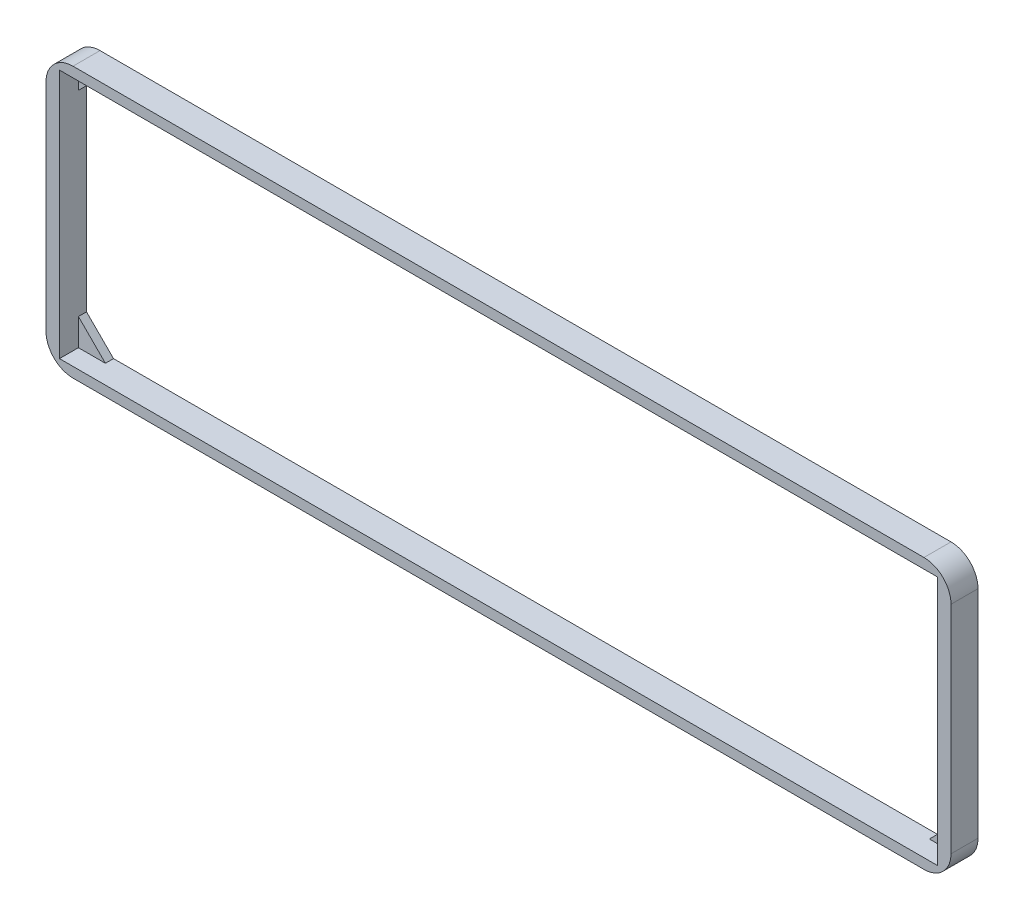
ISO-10303-21;
HEADER;
FILE_DESCRIPTION(('STEP AP214'),'2;1');
FILE_NAME('part.step','',(''),(''),'','','');
FILE_SCHEMA(('AUTOMOTIVE_DESIGN { 1 0 10303 214 1 1 1 1 }'));
ENDSEC;
DATA;
#1=APPLICATION_CONTEXT('core data for automotive mechanical design processes');
#2=APPLICATION_PROTOCOL_DEFINITION('international standard','automotive_design',2000,#1);
#3=PRODUCT_CONTEXT('',#1,'mechanical');
#4=PRODUCT('Part','Part','',(#3));
#5=PRODUCT_RELATED_PRODUCT_CATEGORY('part','',(#4));
#6=PRODUCT_DEFINITION_FORMATION('','',#4);
#7=PRODUCT_DEFINITION_CONTEXT('part definition',#1,'design');
#8=PRODUCT_DEFINITION('design','',#6,#7);
#9=PRODUCT_DEFINITION_SHAPE('','',#8);
#10=(LENGTH_UNIT() NAMED_UNIT(*) SI_UNIT(.MILLI.,.METRE.));
#11=(NAMED_UNIT(*) PLANE_ANGLE_UNIT() SI_UNIT($,.RADIAN.));
#12=(NAMED_UNIT(*) SI_UNIT($,.STERADIAN.) SOLID_ANGLE_UNIT());
#13=UNCERTAINTY_MEASURE_WITH_UNIT(LENGTH_MEASURE(1.E-05),#10,'distance_accuracy_value','');
#14=(GEOMETRIC_REPRESENTATION_CONTEXT(3) GLOBAL_UNCERTAINTY_ASSIGNED_CONTEXT((#13)) GLOBAL_UNIT_ASSIGNED_CONTEXT((#10,
#11,#12)) REPRESENTATION_CONTEXT('',''));
#15=CARTESIAN_POINT('',(0.,0.,0.));
#16=DIRECTION('',(0.,0.,1.));
#17=DIRECTION('',(1.,0.,0.));
#18=AXIS2_PLACEMENT_3D('',#15,#16,#17);
#19=CARTESIAN_POINT('',(167.5,-50.,-10.));
#20=DIRECTION('',(1.,0.,0.));
#21=DIRECTION('',(0.,0.,-1.));
#22=AXIS2_PLACEMENT_3D('',#19,#20,#21);
#23=PLANE('',#22);
#24=DIRECTION('',(0.,1.,0.));
#25=VECTOR('',#24,1.);
#26=CARTESIAN_POINT('',(167.5,-50.,0.));
#27=LINE('',#26,#25);
#28=CARTESIAN_POINT('',(167.5,-40.,0.));
#29=VERTEX_POINT('',#28);
#30=CARTESIAN_POINT('',(167.5,40.,0.));
#31=VERTEX_POINT('',#30);
#32=EDGE_CURVE('E213',#29,#31,#27,.T.);
#33=ORIENTED_EDGE('',*,*,#32,.F.);
#34=DIRECTION('',(0.,0.,1.));
#35=VECTOR('',#34,1.);
#36=CARTESIAN_POINT('',(167.5,-40.,-10.));
#37=LINE('',#36,#35);
#38=CARTESIAN_POINT('',(167.5,-40.,-10.));
#39=VERTEX_POINT('',#38);
#40=EDGE_CURVE('E11',#29,#39,#37,.F.);
#41=ORIENTED_EDGE('',*,*,#40,.T.);
#42=DIRECTION('',(0.,1.,0.));
#43=VECTOR('',#42,1.);
#44=CARTESIAN_POINT('',(167.5,-50.,-10.));
#45=LINE('',#44,#43);
#46=CARTESIAN_POINT('',(167.5,40.,-10.));
#47=VERTEX_POINT('',#46);
#48=EDGE_CURVE('E222',#39,#47,#45,.T.);
#49=ORIENTED_EDGE('',*,*,#48,.T.);
#50=DIRECTION('',(0.,0.,1.));
#51=VECTOR('',#50,1.);
#52=CARTESIAN_POINT('',(167.5,40.,-10.));
#53=LINE('',#52,#51);
#54=EDGE_CURVE('E50',#47,#31,#53,.T.);
#55=ORIENTED_EDGE('',*,*,#54,.T.);
#56=EDGE_LOOP('',(#33,#41,#49,#55));
#57=FACE_BOUND('',#56,.T.);
#58=ADVANCED_FACE('F41',(#57),#23,.T.);
#59=CARTESIAN_POINT('',(-167.5,-50.,-10.));
#60=DIRECTION('',(0.,-1.,0.));
#61=DIRECTION('',(0.,0.,-1.));
#62=AXIS2_PLACEMENT_3D('',#59,#60,#61);
#63=PLANE('',#62);
#64=DIRECTION('',(1.,0.,0.));
#65=VECTOR('',#64,1.);
#66=CARTESIAN_POINT('',(-167.5,-50.,0.));
#67=LINE('',#66,#65);
#68=CARTESIAN_POINT('',(-157.5,-50.,0.));
#69=VERTEX_POINT('',#68);
#70=CARTESIAN_POINT('',(157.5,-50.,0.));
#71=VERTEX_POINT('',#70);
#72=EDGE_CURVE('E227',#69,#71,#67,.T.);
#73=ORIENTED_EDGE('',*,*,#72,.F.);
#74=DIRECTION('',(0.,0.,1.));
#75=VECTOR('',#74,1.);
#76=CARTESIAN_POINT('',(-157.5,-50.,-10.));
#77=LINE('',#76,#75);
#78=CARTESIAN_POINT('',(-157.5,-50.,-10.));
#79=VERTEX_POINT('',#78);
#80=EDGE_CURVE('E293',#69,#79,#77,.F.);
#81=ORIENTED_EDGE('',*,*,#80,.T.);
#82=DIRECTION('',(1.,0.,0.));
#83=VECTOR('',#82,1.);
#84=CARTESIAN_POINT('',(-167.5,-50.,-10.));
#85=LINE('',#84,#83);
#86=CARTESIAN_POINT('',(157.5,-50.,-10.));
#87=VERTEX_POINT('',#86);
#88=EDGE_CURVE('E235',#79,#87,#85,.T.);
#89=ORIENTED_EDGE('',*,*,#88,.T.);
#90=DIRECTION('',(0.,0.,1.));
#91=VECTOR('',#90,1.);
#92=CARTESIAN_POINT('',(157.5,-50.,-10.));
#93=LINE('',#92,#91);
#94=EDGE_CURVE('E289',#87,#71,#93,.T.);
#95=ORIENTED_EDGE('',*,*,#94,.T.);
#96=EDGE_LOOP('',(#73,#81,#89,#95));
#97=FACE_BOUND('',#96,.T.);
#98=ADVANCED_FACE('F311',(#97),#63,.T.);
#99=CARTESIAN_POINT('',(-167.5,-50.,-10.));
#100=DIRECTION('',(-1.,0.,0.));
#101=DIRECTION('',(0.,0.,1.));
#102=AXIS2_PLACEMENT_3D('',#99,#100,#101);
#103=PLANE('',#102);
#104=DIRECTION('',(0.,-1.,0.));
#105=VECTOR('',#104,1.);
#106=CARTESIAN_POINT('',(-167.5,-50.,0.));
#107=LINE('',#106,#105);
#108=CARTESIAN_POINT('',(-167.5,40.,0.));
#109=VERTEX_POINT('',#108);
#110=CARTESIAN_POINT('',(-167.5,-40.,0.));
#111=VERTEX_POINT('',#110);
#112=EDGE_CURVE('E246',#109,#111,#107,.T.);
#113=ORIENTED_EDGE('',*,*,#112,.F.);
#114=DIRECTION('',(0.,0.,1.));
#115=VECTOR('',#114,1.);
#116=CARTESIAN_POINT('',(-167.5,40.,-10.));
#117=LINE('',#116,#115);
#118=CARTESIAN_POINT('',(-167.5,40.,-10.));
#119=VERTEX_POINT('',#118);
#120=EDGE_CURVE('E275',#109,#119,#117,.F.);
#121=ORIENTED_EDGE('',*,*,#120,.T.);
#122=DIRECTION('',(0.,-1.,0.));
#123=VECTOR('',#122,1.);
#124=CARTESIAN_POINT('',(-167.5,-50.,-10.));
#125=LINE('',#124,#123);
#126=CARTESIAN_POINT('',(-167.5,-40.,-10.));
#127=VERTEX_POINT('',#126);
#128=EDGE_CURVE('E231',#119,#127,#125,.T.);
#129=ORIENTED_EDGE('',*,*,#128,.T.);
#130=DIRECTION('',(0.,0.,1.));
#131=VECTOR('',#130,1.);
#132=CARTESIAN_POINT('',(-167.5,-40.,-10.));
#133=LINE('',#132,#131);
#134=EDGE_CURVE('E271',#127,#111,#133,.T.);
#135=ORIENTED_EDGE('',*,*,#134,.T.);
#136=EDGE_LOOP('',(#113,#121,#129,#135));
#137=FACE_BOUND('',#136,.T.);
#138=ADVANCED_FACE('F321',(#137),#103,.T.);
#139=CARTESIAN_POINT('',(-167.5,50.,-10.));
#140=DIRECTION('',(0.,1.,0.));
#141=DIRECTION('',(0.,0.,1.));
#142=AXIS2_PLACEMENT_3D('',#139,#140,#141);
#143=PLANE('',#142);
#144=DIRECTION('',(-1.,0.,0.));
#145=VECTOR('',#144,1.);
#146=CARTESIAN_POINT('',(-167.5,50.,-10.));
#147=LINE('',#146,#145);
#148=CARTESIAN_POINT('',(157.5,50.,-10.));
#149=VERTEX_POINT('',#148);
#150=CARTESIAN_POINT('',(-157.5,50.,-10.));
#151=VERTEX_POINT('',#150);
#152=EDGE_CURVE('E226',#149,#151,#147,.T.);
#153=ORIENTED_EDGE('',*,*,#152,.T.);
#154=DIRECTION('',(0.,0.,1.));
#155=VECTOR('',#154,1.);
#156=CARTESIAN_POINT('',(-157.5,50.,-10.));
#157=LINE('',#156,#155);
#158=CARTESIAN_POINT('',(-157.5,50.,0.));
#159=VERTEX_POINT('',#158);
#160=EDGE_CURVE('E255',#151,#159,#157,.T.);
#161=ORIENTED_EDGE('',*,*,#160,.T.);
#162=DIRECTION('',(-1.,0.,0.));
#163=VECTOR('',#162,1.);
#164=CARTESIAN_POINT('',(-167.5,50.,0.));
#165=LINE('',#164,#163);
#166=CARTESIAN_POINT('',(157.5,50.,0.));
#167=VERTEX_POINT('',#166);
#168=EDGE_CURVE('E242',#167,#159,#165,.T.);
#169=ORIENTED_EDGE('',*,*,#168,.F.);
#170=DIRECTION('',(0.,0.,1.));
#171=VECTOR('',#170,1.);
#172=CARTESIAN_POINT('',(157.5,50.,-10.));
#173=LINE('',#172,#171);
#174=EDGE_CURVE('E238',#167,#149,#173,.F.);
#175=ORIENTED_EDGE('',*,*,#174,.T.);
#176=EDGE_LOOP('',(#153,#161,#169,#175));
#177=FACE_BOUND('',#176,.T.);
#178=ADVANCED_FACE('F328',(#177),#143,.T.);
#179=CARTESIAN_POINT('',(0.,0.,-10.));
#180=DIRECTION('',(0.,0.,-1.));
#181=DIRECTION('',(-1.,0.,0.));
#182=AXIS2_PLACEMENT_3D('',#179,#180,#181);
#183=PLANE('',#182);
#184=DIRECTION('',(0.707106781186548,-0.707106781186547,0.));
#185=VECTOR('',#184,1.);
#186=CARTESIAN_POINT('',(-162.5,-36.25,-10.));
#187=LINE('',#186,#185);
#188=CARTESIAN_POINT('',(-162.5,-36.25,-10.));
#189=VERTEX_POINT('',#188);
#190=CARTESIAN_POINT('',(-152.5,-46.25,-10.));
#191=VERTEX_POINT('',#190);
#192=EDGE_CURVE('E201',#189,#191,#187,.T.);
#193=ORIENTED_EDGE('',*,*,#192,.T.);
#194=DIRECTION('',(1.,0.,0.));
#195=VECTOR('',#194,1.);
#196=CARTESIAN_POINT('',(-162.5,-46.25,-10.));
#197=LINE('',#196,#195);
#198=CARTESIAN_POINT('',(152.5,-46.25,-10.));
#199=VERTEX_POINT('',#198);
#200=EDGE_CURVE('E221',#191,#199,#197,.T.);
#201=ORIENTED_EDGE('',*,*,#200,.T.);
#202=DIRECTION('',(0.707106781186547,0.707106781186547,0.));
#203=VECTOR('',#202,1.);
#204=CARTESIAN_POINT('',(162.5,-36.25,-10.));
#205=LINE('',#204,#203);
#206=CARTESIAN_POINT('',(162.5,-36.25,-10.));
#207=VERTEX_POINT('',#206);
#208=EDGE_CURVE('E572',#199,#207,#205,.T.);
#209=ORIENTED_EDGE('',*,*,#208,.T.);
#210=DIRECTION('',(0.,1.,0.));
#211=VECTOR('',#210,1.);
#212=CARTESIAN_POINT('',(162.5,-46.25,-10.));
#213=LINE('',#212,#211);
#214=CARTESIAN_POINT('',(162.5,36.2499999999998,-10.));
#215=VERTEX_POINT('',#214);
#216=EDGE_CURVE('E553',#207,#215,#213,.T.);
#217=ORIENTED_EDGE('',*,*,#216,.T.);
#218=DIRECTION('',(-0.707106781186542,0.707106781186553,0.));
#219=VECTOR('',#218,1.);
#220=CARTESIAN_POINT('',(152.5,46.25,-10.));
#221=LINE('',#220,#219);
#222=CARTESIAN_POINT('',(152.5,46.25,-10.));
#223=VERTEX_POINT('',#222);
#224=EDGE_CURVE('E57',#215,#223,#221,.T.);
#225=ORIENTED_EDGE('',*,*,#224,.T.);
#226=DIRECTION('',(-1.,0.,0.));
#227=VECTOR('',#226,1.);
#228=CARTESIAN_POINT('',(-162.5,46.25,-10.));
#229=LINE('',#228,#227);
#230=CARTESIAN_POINT('',(-152.5,46.25,-10.));
#231=VERTEX_POINT('',#230);
#232=EDGE_CURVE('E556',#223,#231,#229,.T.);
#233=ORIENTED_EDGE('',*,*,#232,.T.);
#234=DIRECTION('',(-0.707106781186548,-0.707106781186547,0.));
#235=VECTOR('',#234,1.);
#236=CARTESIAN_POINT('',(-152.5,46.25,-10.));
#237=LINE('',#236,#235);
#238=CARTESIAN_POINT('',(-162.5,36.25,-10.));
#239=VERTEX_POINT('',#238);
#240=EDGE_CURVE('E621',#231,#239,#237,.T.);
#241=ORIENTED_EDGE('',*,*,#240,.T.);
#242=DIRECTION('',(0.,-1.,0.));
#243=VECTOR('',#242,1.);
#244=CARTESIAN_POINT('',(-162.5,-46.25,-10.));
#245=LINE('',#244,#243);
#246=EDGE_CURVE('E561',#239,#189,#245,.T.);
#247=ORIENTED_EDGE('',*,*,#246,.T.);
#248=EDGE_LOOP('',(#193,#201,#209,#217,#225,#233,#241,#247));
#249=FACE_BOUND('',#248,.T.);
#250=ORIENTED_EDGE('',*,*,#128,.F.);
#251=CARTESIAN_POINT('',(-157.5,40.,-10.));
#252=DIRECTION('',(0.,0.,-1.));
#253=DIRECTION('',(-1.,0.,0.));
#254=AXIS2_PLACEMENT_3D('',#251,#252,#253);
#255=CIRCLE('',#254,10.);
#256=EDGE_CURVE('E286',#119,#151,#255,.T.);
#257=ORIENTED_EDGE('',*,*,#256,.T.);
#258=ORIENTED_EDGE('',*,*,#152,.F.);
#259=CARTESIAN_POINT('',(157.5,40.,-10.));
#260=DIRECTION('',(0.,0.,-1.));
#261=DIRECTION('',(-1.,0.,0.));
#262=AXIS2_PLACEMENT_3D('',#259,#260,#261);
#263=CIRCLE('',#262,10.);
#264=EDGE_CURVE('E278',#149,#47,#263,.T.);
#265=ORIENTED_EDGE('',*,*,#264,.T.);
#266=ORIENTED_EDGE('',*,*,#48,.F.);
#267=CARTESIAN_POINT('',(157.5,-40.,-10.));
#268=DIRECTION('',(0.,0.,-1.));
#269=DIRECTION('',(-1.,0.,0.));
#270=AXIS2_PLACEMENT_3D('',#267,#268,#269);
#271=CIRCLE('',#270,10.);
#272=EDGE_CURVE('E65',#39,#87,#271,.T.);
#273=ORIENTED_EDGE('',*,*,#272,.T.);
#274=ORIENTED_EDGE('',*,*,#88,.F.);
#275=CARTESIAN_POINT('',(-157.5,-40.,-10.));
#276=DIRECTION('',(0.,0.,-1.));
#277=DIRECTION('',(-1.,0.,0.));
#278=AXIS2_PLACEMENT_3D('',#275,#276,#277);
#279=CIRCLE('',#278,10.);
#280=EDGE_CURVE('E283',#79,#127,#279,.T.);
#281=ORIENTED_EDGE('',*,*,#280,.T.);
#282=EDGE_LOOP('',(#250,#257,#258,#265,#266,#273,#274,#281));
#283=FACE_BOUND('',#282,.T.);
#284=ADVANCED_FACE('F315',(#249,#283),#183,.T.);
#285=CARTESIAN_POINT('',(0.,0.,0.));
#286=DIRECTION('',(0.,0.,-1.));
#287=DIRECTION('',(-1.,0.,0.));
#288=AXIS2_PLACEMENT_3D('',#285,#286,#287);
#289=PLANE('',#288);
#290=DIRECTION('',(-1.,0.,0.));
#291=VECTOR('',#290,1.);
#292=CARTESIAN_POINT('',(-162.5,46.25,0.));
#293=LINE('',#292,#291);
#294=CARTESIAN_POINT('',(162.5,46.25,0.));
#295=VERTEX_POINT('',#294);
#296=CARTESIAN_POINT('',(-162.5,46.25,0.));
#297=VERTEX_POINT('',#296);
#298=EDGE_CURVE('E539',#295,#297,#293,.T.);
#299=ORIENTED_EDGE('',*,*,#298,.F.);
#300=DIRECTION('',(0.,1.,0.));
#301=VECTOR('',#300,1.);
#302=CARTESIAN_POINT('',(162.5,-46.25,0.));
#303=LINE('',#302,#301);
#304=CARTESIAN_POINT('',(162.5,-46.25,0.));
#305=VERTEX_POINT('',#304);
#306=EDGE_CURVE('E541',#305,#295,#303,.T.);
#307=ORIENTED_EDGE('',*,*,#306,.F.);
#308=DIRECTION('',(1.,0.,0.));
#309=VECTOR('',#308,1.);
#310=CARTESIAN_POINT('',(-162.5,-46.25,0.));
#311=LINE('',#310,#309);
#312=CARTESIAN_POINT('',(-162.5,-46.25,0.));
#313=VERTEX_POINT('',#312);
#314=EDGE_CURVE('E547',#313,#305,#311,.T.);
#315=ORIENTED_EDGE('',*,*,#314,.F.);
#316=DIRECTION('',(0.,-1.,0.));
#317=VECTOR('',#316,1.);
#318=CARTESIAN_POINT('',(-162.5,-46.25,0.));
#319=LINE('',#318,#317);
#320=EDGE_CURVE('E205',#297,#313,#319,.T.);
#321=ORIENTED_EDGE('',*,*,#320,.F.);
#322=EDGE_LOOP('',(#299,#307,#315,#321));
#323=FACE_BOUND('',#322,.T.);
#324=ORIENTED_EDGE('',*,*,#168,.T.);
#325=CARTESIAN_POINT('',(-157.5,40.,0.));
#326=DIRECTION('',(0.,0.,-1.));
#327=DIRECTION('',(-1.,0.,0.));
#328=AXIS2_PLACEMENT_3D('',#325,#326,#327);
#329=CIRCLE('',#328,10.);
#330=EDGE_CURVE('E268',#159,#109,#329,.F.);
#331=ORIENTED_EDGE('',*,*,#330,.T.);
#332=ORIENTED_EDGE('',*,*,#112,.T.);
#333=CARTESIAN_POINT('',(-157.5,-40.,0.));
#334=DIRECTION('',(0.,0.,-1.));
#335=DIRECTION('',(-1.,0.,0.));
#336=AXIS2_PLACEMENT_3D('',#333,#334,#335);
#337=CIRCLE('',#336,10.);
#338=EDGE_CURVE('E265',#111,#69,#337,.F.);
#339=ORIENTED_EDGE('',*,*,#338,.T.);
#340=ORIENTED_EDGE('',*,*,#72,.T.);
#341=CARTESIAN_POINT('',(157.5,-40.,0.));
#342=DIRECTION('',(0.,0.,-1.));
#343=DIRECTION('',(-1.,0.,0.));
#344=AXIS2_PLACEMENT_3D('',#341,#342,#343);
#345=CIRCLE('',#344,10.);
#346=EDGE_CURVE('E262',#71,#29,#345,.F.);
#347=ORIENTED_EDGE('',*,*,#346,.T.);
#348=ORIENTED_EDGE('',*,*,#32,.T.);
#349=CARTESIAN_POINT('',(157.5,40.,0.));
#350=DIRECTION('',(0.,0.,-1.));
#351=DIRECTION('',(-1.,0.,0.));
#352=AXIS2_PLACEMENT_3D('',#349,#350,#351);
#353=CIRCLE('',#352,10.);
#354=EDGE_CURVE('E259',#31,#167,#353,.F.);
#355=ORIENTED_EDGE('',*,*,#354,.T.);
#356=EDGE_LOOP('',(#324,#331,#332,#339,#340,#347,#348,#355));
#357=FACE_BOUND('',#356,.T.);
#358=ADVANCED_FACE('F304',(#323,#357),#289,.F.);
#359=CARTESIAN_POINT('',(162.5,-46.25,-10.));
#360=DIRECTION('',(1.,0.,0.));
#361=DIRECTION('',(0.,0.,-1.));
#362=AXIS2_PLACEMENT_3D('',#359,#360,#361);
#363=PLANE('',#362);
#364=DIRECTION('',(0.,-1.,0.));
#365=VECTOR('',#364,1.);
#366=CARTESIAN_POINT('',(162.5,36.2499999999998,-7.));
#367=LINE('',#366,#365);
#368=CARTESIAN_POINT('',(162.5,46.25,-7.));
#369=VERTEX_POINT('',#368);
#370=CARTESIAN_POINT('',(162.5,36.2499999999998,-7.));
#371=VERTEX_POINT('',#370);
#372=EDGE_CURVE('E603',#369,#371,#367,.T.);
#373=ORIENTED_EDGE('',*,*,#372,.T.);
#374=DIRECTION('',(0.,0.,-1.));
#375=VECTOR('',#374,1.);
#376=CARTESIAN_POINT('',(162.5,36.2499999999998,-7.));
#377=LINE('',#376,#375);
#378=EDGE_CURVE('E594',#371,#215,#377,.T.);
#379=ORIENTED_EDGE('',*,*,#378,.T.);
#380=ORIENTED_EDGE('',*,*,#216,.F.);
#381=DIRECTION('',(0.,0.,-1.));
#382=VECTOR('',#381,1.);
#383=CARTESIAN_POINT('',(162.5,-36.25,-7.));
#384=LINE('',#383,#382);
#385=CARTESIAN_POINT('',(162.5,-36.25,-7.));
#386=VERTEX_POINT('',#385);
#387=EDGE_CURVE('E549',#386,#207,#384,.T.);
#388=ORIENTED_EDGE('',*,*,#387,.F.);
#389=DIRECTION('',(0.,-1.,0.));
#390=VECTOR('',#389,1.);
#391=CARTESIAN_POINT('',(162.5,-46.25,-7.));
#392=LINE('',#391,#390);
#393=CARTESIAN_POINT('',(162.5,-46.25,-7.));
#394=VERTEX_POINT('',#393);
#395=EDGE_CURVE('E582',#386,#394,#392,.T.);
#396=ORIENTED_EDGE('',*,*,#395,.T.);
#397=DIRECTION('',(0.,0.,1.));
#398=VECTOR('',#397,1.);
#399=CARTESIAN_POINT('',(162.5,-46.25,-10.));
#400=LINE('',#399,#398);
#401=EDGE_CURVE('E208',#394,#305,#400,.T.);
#402=ORIENTED_EDGE('',*,*,#401,.T.);
#403=ORIENTED_EDGE('',*,*,#306,.T.);
#404=DIRECTION('',(0.,0.,1.));
#405=VECTOR('',#404,1.);
#406=CARTESIAN_POINT('',(162.5,46.25,-10.));
#407=LINE('',#406,#405);
#408=EDGE_CURVE('E215',#369,#295,#407,.T.);
#409=ORIENTED_EDGE('',*,*,#408,.F.);
#410=EDGE_LOOP('',(#373,#379,#380,#388,#396,#402,#403,#409));
#411=FACE_BOUND('',#410,.T.);
#412=ADVANCED_FACE('F384',(#411),#363,.F.);
#413=CARTESIAN_POINT('',(-162.5,-46.25,-10.));
#414=DIRECTION('',(0.,-1.,0.));
#415=DIRECTION('',(0.,0.,-1.));
#416=AXIS2_PLACEMENT_3D('',#413,#414,#415);
#417=PLANE('',#416);
#418=ORIENTED_EDGE('',*,*,#200,.F.);
#419=DIRECTION('',(0.,0.,-1.));
#420=VECTOR('',#419,1.);
#421=CARTESIAN_POINT('',(-152.5,-46.25,-7.));
#422=LINE('',#421,#420);
#423=CARTESIAN_POINT('',(-152.5,-46.25,-7.));
#424=VERTEX_POINT('',#423);
#425=EDGE_CURVE('E199',#424,#191,#422,.T.);
#426=ORIENTED_EDGE('',*,*,#425,.F.);
#427=DIRECTION('',(-1.,0.,0.));
#428=VECTOR('',#427,1.);
#429=CARTESIAN_POINT('',(-152.5,-46.25,-7.));
#430=LINE('',#429,#428);
#431=CARTESIAN_POINT('',(-162.5,-46.25,-7.));
#432=VERTEX_POINT('',#431);
#433=EDGE_CURVE('E184',#424,#432,#430,.T.);
#434=ORIENTED_EDGE('',*,*,#433,.T.);
#435=DIRECTION('',(0.,0.,1.));
#436=VECTOR('',#435,1.);
#437=CARTESIAN_POINT('',(-162.5,-46.25,-10.));
#438=LINE('',#437,#436);
#439=EDGE_CURVE('E197',#432,#313,#438,.T.);
#440=ORIENTED_EDGE('',*,*,#439,.T.);
#441=ORIENTED_EDGE('',*,*,#314,.T.);
#442=ORIENTED_EDGE('',*,*,#401,.F.);
#443=DIRECTION('',(-1.,0.,0.));
#444=VECTOR('',#443,1.);
#445=CARTESIAN_POINT('',(152.5,-46.25,-7.));
#446=LINE('',#445,#444);
#447=CARTESIAN_POINT('',(152.5,-46.25,-7.));
#448=VERTEX_POINT('',#447);
#449=EDGE_CURVE('E577',#394,#448,#446,.T.);
#450=ORIENTED_EDGE('',*,*,#449,.T.);
#451=DIRECTION('',(0.,0.,-1.));
#452=VECTOR('',#451,1.);
#453=CARTESIAN_POINT('',(152.5,-46.25,-7.));
#454=LINE('',#453,#452);
#455=EDGE_CURVE('E564',#448,#199,#454,.T.);
#456=ORIENTED_EDGE('',*,*,#455,.T.);
#457=EDGE_LOOP('',(#418,#426,#434,#440,#441,#442,#450,#456));
#458=FACE_BOUND('',#457,.T.);
#459=ADVANCED_FACE('F195',(#458),#417,.F.);
#460=CARTESIAN_POINT('',(-162.5,-46.25,-10.));
#461=DIRECTION('',(-1.,0.,0.));
#462=DIRECTION('',(0.,0.,1.));
#463=AXIS2_PLACEMENT_3D('',#460,#461,#462);
#464=PLANE('',#463);
#465=DIRECTION('',(0.,1.,0.));
#466=VECTOR('',#465,1.);
#467=CARTESIAN_POINT('',(-162.5,-46.25,-7.));
#468=LINE('',#467,#466);
#469=CARTESIAN_POINT('',(-162.5,-36.25,-7.));
#470=VERTEX_POINT('',#469);
#471=EDGE_CURVE('E181',#432,#470,#468,.T.);
#472=ORIENTED_EDGE('',*,*,#471,.T.);
#473=DIRECTION('',(0.,0.,-1.));
#474=VECTOR('',#473,1.);
#475=CARTESIAN_POINT('',(-162.5,-36.25,-7.));
#476=LINE('',#475,#474);
#477=EDGE_CURVE('E636',#470,#189,#476,.T.);
#478=ORIENTED_EDGE('',*,*,#477,.T.);
#479=ORIENTED_EDGE('',*,*,#246,.F.);
#480=DIRECTION('',(0.,0.,-1.));
#481=VECTOR('',#480,1.);
#482=CARTESIAN_POINT('',(-162.5,36.25,-7.));
#483=LINE('',#482,#481);
#484=CARTESIAN_POINT('',(-162.5,36.25,-7.));
#485=VERTEX_POINT('',#484);
#486=EDGE_CURVE('E604',#485,#239,#483,.T.);
#487=ORIENTED_EDGE('',*,*,#486,.F.);
#488=DIRECTION('',(0.,1.,0.));
#489=VECTOR('',#488,1.);
#490=CARTESIAN_POINT('',(-162.5,36.25,-7.));
#491=LINE('',#490,#489);
#492=CARTESIAN_POINT('',(-162.5,46.25,-7.));
#493=VERTEX_POINT('',#492);
#494=EDGE_CURVE('E625',#485,#493,#491,.T.);
#495=ORIENTED_EDGE('',*,*,#494,.T.);
#496=DIRECTION('',(0.,0.,1.));
#497=VECTOR('',#496,1.);
#498=CARTESIAN_POINT('',(-162.5,46.25,-10.));
#499=LINE('',#498,#497);
#500=EDGE_CURVE('E209',#493,#297,#499,.T.);
#501=ORIENTED_EDGE('',*,*,#500,.T.);
#502=ORIENTED_EDGE('',*,*,#320,.T.);
#503=ORIENTED_EDGE('',*,*,#439,.F.);
#504=EDGE_LOOP('',(#472,#478,#479,#487,#495,#501,#502,#503));
#505=FACE_BOUND('',#504,.T.);
#506=ADVANCED_FACE('F203',(#505),#464,.F.);
#507=CARTESIAN_POINT('',(-162.5,46.25,-10.));
#508=DIRECTION('',(0.,1.,0.));
#509=DIRECTION('',(0.,0.,1.));
#510=AXIS2_PLACEMENT_3D('',#507,#508,#509);
#511=PLANE('',#510);
#512=DIRECTION('',(1.,0.,0.));
#513=VECTOR('',#512,1.);
#514=CARTESIAN_POINT('',(-162.5,46.25,-7.));
#515=LINE('',#514,#513);
#516=CARTESIAN_POINT('',(-152.5,46.25,-7.));
#517=VERTEX_POINT('',#516);
#518=EDGE_CURVE('E629',#493,#517,#515,.T.);
#519=ORIENTED_EDGE('',*,*,#518,.T.);
#520=DIRECTION('',(0.,0.,-1.));
#521=VECTOR('',#520,1.);
#522=CARTESIAN_POINT('',(-152.5,46.25,-7.));
#523=LINE('',#522,#521);
#524=EDGE_CURVE('E614',#517,#231,#523,.T.);
#525=ORIENTED_EDGE('',*,*,#524,.T.);
#526=ORIENTED_EDGE('',*,*,#232,.F.);
#527=DIRECTION('',(0.,0.,-1.));
#528=VECTOR('',#527,1.);
#529=CARTESIAN_POINT('',(152.5,46.25,-7.));
#530=LINE('',#529,#528);
#531=CARTESIAN_POINT('',(152.5,46.25,-7.));
#532=VERTEX_POINT('',#531);
#533=EDGE_CURVE('E578',#532,#223,#530,.T.);
#534=ORIENTED_EDGE('',*,*,#533,.F.);
#535=DIRECTION('',(1.,0.,0.));
#536=VECTOR('',#535,1.);
#537=CARTESIAN_POINT('',(162.5,46.25,-7.));
#538=LINE('',#537,#536);
#539=EDGE_CURVE('E598',#532,#369,#538,.T.);
#540=ORIENTED_EDGE('',*,*,#539,.T.);
#541=ORIENTED_EDGE('',*,*,#408,.T.);
#542=ORIENTED_EDGE('',*,*,#298,.T.);
#543=ORIENTED_EDGE('',*,*,#500,.F.);
#544=EDGE_LOOP('',(#519,#525,#526,#534,#540,#541,#542,#543));
#545=FACE_BOUND('',#544,.T.);
#546=ADVANCED_FACE('F351',(#545),#511,.F.);
#547=CARTESIAN_POINT('',(-157.5,40.,-10.));
#548=DIRECTION('',(0.,0.,1.));
#549=DIRECTION('',(1.,0.,0.));
#550=AXIS2_PLACEMENT_3D('',#547,#548,#549);
#551=CYLINDRICAL_SURFACE('',#550,10.);
#552=ORIENTED_EDGE('',*,*,#256,.F.);
#553=ORIENTED_EDGE('',*,*,#120,.F.);
#554=ORIENTED_EDGE('',*,*,#330,.F.);
#555=ORIENTED_EDGE('',*,*,#160,.F.);
#556=EDGE_LOOP('',(#552,#553,#554,#555));
#557=FACE_BOUND('',#556,.T.);
#558=ADVANCED_FACE('F326',(#557),#551,.T.);
#559=CARTESIAN_POINT('',(-157.5,-40.,-10.));
#560=DIRECTION('',(0.,0.,1.));
#561=DIRECTION('',(1.,0.,0.));
#562=AXIS2_PLACEMENT_3D('',#559,#560,#561);
#563=CYLINDRICAL_SURFACE('',#562,10.);
#564=ORIENTED_EDGE('',*,*,#280,.F.);
#565=ORIENTED_EDGE('',*,*,#80,.F.);
#566=ORIENTED_EDGE('',*,*,#338,.F.);
#567=ORIENTED_EDGE('',*,*,#134,.F.);
#568=EDGE_LOOP('',(#564,#565,#566,#567));
#569=FACE_BOUND('',#568,.T.);
#570=ADVANCED_FACE('F318',(#569),#563,.T.);
#571=CARTESIAN_POINT('',(157.5,-40.,-10.));
#572=DIRECTION('',(0.,0.,1.));
#573=DIRECTION('',(1.,0.,0.));
#574=AXIS2_PLACEMENT_3D('',#571,#572,#573);
#575=CYLINDRICAL_SURFACE('',#574,10.);
#576=ORIENTED_EDGE('',*,*,#272,.F.);
#577=ORIENTED_EDGE('',*,*,#40,.F.);
#578=ORIENTED_EDGE('',*,*,#346,.F.);
#579=ORIENTED_EDGE('',*,*,#94,.F.);
#580=EDGE_LOOP('',(#576,#577,#578,#579));
#581=FACE_BOUND('',#580,.T.);
#582=ADVANCED_FACE('F309',(#581),#575,.T.);
#583=CARTESIAN_POINT('',(157.5,40.,-10.));
#584=DIRECTION('',(0.,0.,1.));
#585=DIRECTION('',(1.,0.,0.));
#586=AXIS2_PLACEMENT_3D('',#583,#584,#585);
#587=CYLINDRICAL_SURFACE('',#586,10.);
#588=ORIENTED_EDGE('',*,*,#264,.F.);
#589=ORIENTED_EDGE('',*,*,#174,.F.);
#590=ORIENTED_EDGE('',*,*,#354,.F.);
#591=ORIENTED_EDGE('',*,*,#54,.F.);
#592=EDGE_LOOP('',(#588,#589,#590,#591));
#593=FACE_BOUND('',#592,.T.);
#594=ADVANCED_FACE('F43',(#593),#587,.T.);
#595=CARTESIAN_POINT('',(162.5,-36.25,-7.));
#596=DIRECTION('',(-0.707106781186548,0.707106781186548,0.));
#597=DIRECTION('',(-0.707106781186548,-0.707106781186548,0.));
#598=AXIS2_PLACEMENT_3D('',#595,#596,#597);
#599=PLANE('',#598);
#600=ORIENTED_EDGE('',*,*,#208,.F.);
#601=ORIENTED_EDGE('',*,*,#455,.F.);
#602=DIRECTION('',(0.707106781186547,0.707106781186547,0.));
#603=VECTOR('',#602,1.);
#604=CARTESIAN_POINT('',(162.5,-36.25,-7.));
#605=LINE('',#604,#603);
#606=EDGE_CURVE('E586',#448,#386,#605,.T.);
#607=ORIENTED_EDGE('',*,*,#606,.T.);
#608=ORIENTED_EDGE('',*,*,#387,.T.);
#609=EDGE_LOOP('',(#600,#601,#607,#608));
#610=FACE_BOUND('',#609,.T.);
#611=ADVANCED_FACE('F332',(#610),#599,.T.);
#612=CARTESIAN_POINT('',(0.,0.,-7.));
#613=DIRECTION('',(0.,0.,1.));
#614=DIRECTION('',(1.,0.,0.));
#615=AXIS2_PLACEMENT_3D('',#612,#613,#614);
#616=PLANE('',#615);
#617=ORIENTED_EDGE('',*,*,#449,.F.);
#618=ORIENTED_EDGE('',*,*,#395,.F.);
#619=ORIENTED_EDGE('',*,*,#606,.F.);
#620=EDGE_LOOP('',(#617,#618,#619));
#621=FACE_BOUND('',#620,.T.);
#622=ADVANCED_FACE('F337',(#621),#616,.T.);
#623=CARTESIAN_POINT('',(152.5,46.25,-7.));
#624=DIRECTION('',(-0.707106781186553,-0.707106781186542,0.));
#625=DIRECTION('',(0.707106781186542,-0.707106781186553,0.));
#626=AXIS2_PLACEMENT_3D('',#623,#624,#625);
#627=PLANE('',#626);
#628=ORIENTED_EDGE('',*,*,#224,.F.);
#629=ORIENTED_EDGE('',*,*,#378,.F.);
#630=DIRECTION('',(-0.707106781186542,0.707106781186553,0.));
#631=VECTOR('',#630,1.);
#632=CARTESIAN_POINT('',(152.5,46.25,-7.));
#633=LINE('',#632,#631);
#634=EDGE_CURVE('E608',#371,#532,#633,.T.);
#635=ORIENTED_EDGE('',*,*,#634,.T.);
#636=ORIENTED_EDGE('',*,*,#533,.T.);
#637=EDGE_LOOP('',(#628,#629,#635,#636));
#638=FACE_BOUND('',#637,.T.);
#639=ADVANCED_FACE('F429',(#638),#627,.T.);
#640=CARTESIAN_POINT('',(0.,0.,-7.));
#641=DIRECTION('',(0.,0.,1.));
#642=DIRECTION('',(1.,0.,0.));
#643=AXIS2_PLACEMENT_3D('',#640,#641,#642);
#644=PLANE('',#643);
#645=ORIENTED_EDGE('',*,*,#372,.F.);
#646=ORIENTED_EDGE('',*,*,#539,.F.);
#647=ORIENTED_EDGE('',*,*,#634,.F.);
#648=EDGE_LOOP('',(#645,#646,#647));
#649=FACE_BOUND('',#648,.T.);
#650=ADVANCED_FACE('F439',(#649),#644,.T.);
#651=CARTESIAN_POINT('',(-152.5,46.25,-7.));
#652=DIRECTION('',(0.707106781186547,-0.707106781186548,0.));
#653=DIRECTION('',(0.707106781186548,0.707106781186547,0.));
#654=AXIS2_PLACEMENT_3D('',#651,#652,#653);
#655=PLANE('',#654);
#656=ORIENTED_EDGE('',*,*,#240,.F.);
#657=ORIENTED_EDGE('',*,*,#524,.F.);
#658=DIRECTION('',(-0.707106781186548,-0.707106781186547,0.));
#659=VECTOR('',#658,1.);
#660=CARTESIAN_POINT('',(-152.5,46.25,-7.));
#661=LINE('',#660,#659);
#662=EDGE_CURVE('E618',#517,#485,#661,.T.);
#663=ORIENTED_EDGE('',*,*,#662,.T.);
#664=ORIENTED_EDGE('',*,*,#486,.T.);
#665=EDGE_LOOP('',(#656,#657,#663,#664));
#666=FACE_BOUND('',#665,.T.);
#667=ADVANCED_FACE('F449',(#666),#655,.T.);
#668=CARTESIAN_POINT('',(0.,0.,-7.));
#669=DIRECTION('',(0.,0.,-1.));
#670=DIRECTION('',(-1.,0.,0.));
#671=AXIS2_PLACEMENT_3D('',#668,#669,#670);
#672=PLANE('',#671);
#673=ORIENTED_EDGE('',*,*,#494,.F.);
#674=ORIENTED_EDGE('',*,*,#662,.F.);
#675=ORIENTED_EDGE('',*,*,#518,.F.);
#676=EDGE_LOOP('',(#673,#674,#675));
#677=FACE_BOUND('',#676,.T.);
#678=ADVANCED_FACE('F459',(#677),#672,.F.);
#679=CARTESIAN_POINT('',(-162.5,-36.25,-7.));
#680=DIRECTION('',(0.707106781186547,0.707106781186548,0.));
#681=DIRECTION('',(-0.707106781186548,0.707106781186547,0.));
#682=AXIS2_PLACEMENT_3D('',#679,#680,#681);
#683=PLANE('',#682);
#684=ORIENTED_EDGE('',*,*,#192,.F.);
#685=ORIENTED_EDGE('',*,*,#477,.F.);
#686=DIRECTION('',(0.707106781186548,-0.707106781186547,0.));
#687=VECTOR('',#686,1.);
#688=CARTESIAN_POINT('',(-162.5,-36.25,-7.));
#689=LINE('',#688,#687);
#690=EDGE_CURVE('E186',#470,#424,#689,.T.);
#691=ORIENTED_EDGE('',*,*,#690,.T.);
#692=ORIENTED_EDGE('',*,*,#425,.T.);
#693=EDGE_LOOP('',(#684,#685,#691,#692));
#694=FACE_BOUND('',#693,.T.);
#695=ADVANCED_FACE('F469',(#694),#683,.T.);
#696=CARTESIAN_POINT('',(0.,0.,-7.));
#697=DIRECTION('',(0.,0.,-1.));
#698=DIRECTION('',(-1.,0.,0.));
#699=AXIS2_PLACEMENT_3D('',#696,#697,#698);
#700=PLANE('',#699);
#701=ORIENTED_EDGE('',*,*,#433,.F.);
#702=ORIENTED_EDGE('',*,*,#690,.F.);
#703=ORIENTED_EDGE('',*,*,#471,.F.);
#704=EDGE_LOOP('',(#701,#702,#703));
#705=FACE_BOUND('',#704,.T.);
#706=ADVANCED_FACE('F183',(#705),#700,.F.);
#707=CLOSED_SHELL('',(#58,#98,#138,#178,#284,#358,#412,#459,#506,#546,#558,#570,#582,#594,#611,
#622,#639,#650,#667,#678,#695,#706));
#708=MANIFOLD_SOLID_BREP('B2',#707);
#709=ADVANCED_BREP_SHAPE_REPRESENTATION('',(#18,#708),#14);
#710=SHAPE_DEFINITION_REPRESENTATION(#9,#709);
ENDSEC;
END-ISO-10303-21;
